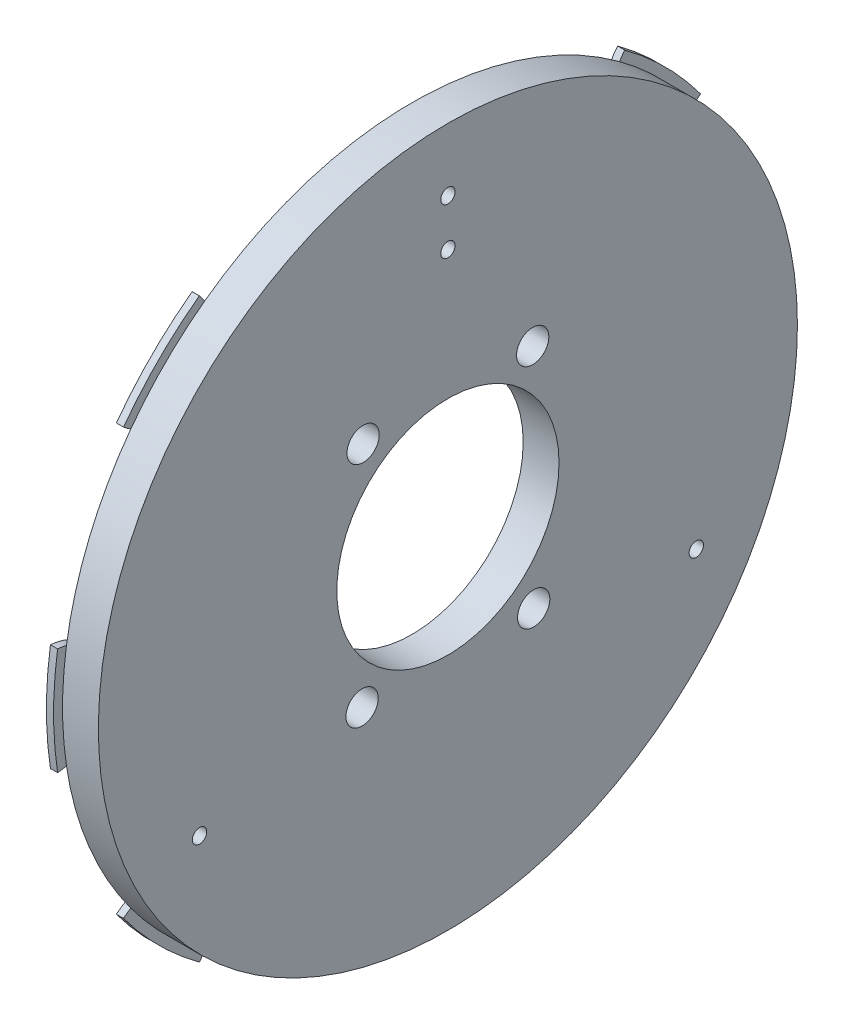
ISO-10303-21;
HEADER;
FILE_DESCRIPTION(('STEP AP214'),'2;1');
FILE_NAME('part.step','',(''),(''),'','','');
FILE_SCHEMA(('AUTOMOTIVE_DESIGN { 1 0 10303 214 1 1 1 1 }'));
ENDSEC;
DATA;
#1=APPLICATION_CONTEXT('core data for automotive mechanical design processes');
#2=APPLICATION_PROTOCOL_DEFINITION('international standard','automotive_design',2000,#1);
#3=PRODUCT_CONTEXT('',#1,'mechanical');
#4=PRODUCT('Part','Part','',(#3));
#5=PRODUCT_RELATED_PRODUCT_CATEGORY('part','',(#4));
#6=PRODUCT_DEFINITION_FORMATION('','',#4);
#7=PRODUCT_DEFINITION_CONTEXT('part definition',#1,'design');
#8=PRODUCT_DEFINITION('design','',#6,#7);
#9=PRODUCT_DEFINITION_SHAPE('','',#8);
#10=(LENGTH_UNIT() NAMED_UNIT(*) SI_UNIT(.MILLI.,.METRE.));
#11=(NAMED_UNIT(*) PLANE_ANGLE_UNIT() SI_UNIT($,.RADIAN.));
#12=(NAMED_UNIT(*) SI_UNIT($,.STERADIAN.) SOLID_ANGLE_UNIT());
#13=UNCERTAINTY_MEASURE_WITH_UNIT(LENGTH_MEASURE(1.E-05),#10,'distance_accuracy_value','');
#14=(GEOMETRIC_REPRESENTATION_CONTEXT(3) GLOBAL_UNCERTAINTY_ASSIGNED_CONTEXT((#13)) GLOBAL_UNIT_ASSIGNED_CONTEXT((#10,
#11,#12)) REPRESENTATION_CONTEXT('',''));
#15=CARTESIAN_POINT('',(0.,0.,0.));
#16=DIRECTION('',(0.,0.,1.));
#17=DIRECTION('',(1.,0.,0.));
#18=AXIS2_PLACEMENT_3D('',#15,#16,#17);
#19=CARTESIAN_POINT('',(2.,0.,0.));
#20=DIRECTION('',(1.,0.,0.));
#21=DIRECTION('',(0.,0.,-1.));
#22=AXIS2_PLACEMENT_3D('',#19,#20,#21);
#23=PLANE('',#22);
#24=CARTESIAN_POINT('',(2.,-40.000000000003,69.28203230275));
#25=DIRECTION('',(1.,0.,0.));
#26=DIRECTION('',(0.,0.,-1.));
#27=AXIS2_PLACEMENT_3D('',#24,#25,#26);
#28=CIRCLE('',#27,2.);
#29=CARTESIAN_POINT('',(2.,-40.000000000003,67.28203230275));
#30=VERTEX_POINT('',#29);
#31=EDGE_CURVE('E380',#30,#30,#28,.T.);
#32=ORIENTED_EDGE('',*,*,#31,.T.);
#33=EDGE_LOOP('',(#32));
#34=FACE_BOUND('',#33,.T.);
#35=CARTESIAN_POINT('',(2.,-39.999999999997,-69.2820323027602));
#36=DIRECTION('',(1.,0.,0.));
#37=DIRECTION('',(0.,0.,-1.));
#38=AXIS2_PLACEMENT_3D('',#35,#36,#37);
#39=CIRCLE('',#38,2.);
#40=CARTESIAN_POINT('',(2.,-39.999999999997,-71.2820323027602));
#41=VERTEX_POINT('',#40);
#42=EDGE_CURVE('E385',#41,#41,#39,.T.);
#43=ORIENTED_EDGE('',*,*,#42,.T.);
#44=EDGE_LOOP('',(#43));
#45=FACE_BOUND('',#44,.T.);
#46=CARTESIAN_POINT('',(2.,31.8556607999269,23.65));
#47=DIRECTION('',(1.,0.,0.));
#48=DIRECTION('',(0.,0.,-1.));
#49=AXIS2_PLACEMENT_3D('',#46,#47,#48);
#50=CIRCLE('',#49,4.50000000000001);
#51=CARTESIAN_POINT('',(2.,31.8556607999269,19.15));
#52=VERTEX_POINT('',#51);
#53=EDGE_CURVE('E393',#52,#52,#50,.T.);
#54=ORIENTED_EDGE('',*,*,#53,.T.);
#55=EDGE_LOOP('',(#54));
#56=FACE_BOUND('',#55,.T.);
#57=CARTESIAN_POINT('',(2.,-31.643709244987,23.9328496050663));
#58=DIRECTION('',(1.,0.,0.));
#59=DIRECTION('',(0.,0.,-1.));
#60=AXIS2_PLACEMENT_3D('',#57,#58,#59);
#61=CIRCLE('',#60,4.5);
#62=CARTESIAN_POINT('',(2.,-31.643709244987,19.4328496050663));
#63=VERTEX_POINT('',#62);
#64=EDGE_CURVE('E401',#63,#63,#61,.T.);
#65=ORIENTED_EDGE('',*,*,#64,.T.);
#66=EDGE_LOOP('',(#65));
#67=FACE_BOUND('',#66,.T.);
#68=CARTESIAN_POINT('',(2.,-31.643709244987,-23.9328496050663));
#69=DIRECTION('',(1.,0.,0.));
#70=DIRECTION('',(0.,0.,-1.));
#71=AXIS2_PLACEMENT_3D('',#68,#69,#70);
#72=CIRCLE('',#71,4.5);
#73=CARTESIAN_POINT('',(2.,-31.643709244987,-28.4328496050663));
#74=VERTEX_POINT('',#73);
#75=EDGE_CURVE('E409',#74,#74,#72,.T.);
#76=ORIENTED_EDGE('',*,*,#75,.T.);
#77=EDGE_LOOP('',(#76));
#78=FACE_BOUND('',#77,.T.);
#79=CARTESIAN_POINT('',(2.,31.8556607999269,-23.65));
#80=DIRECTION('',(1.,0.,0.));
#81=DIRECTION('',(0.,0.,-1.));
#82=AXIS2_PLACEMENT_3D('',#79,#80,#81);
#83=CIRCLE('',#82,4.50000000000001);
#84=CARTESIAN_POINT('',(2.,31.8556607999269,-28.15));
#85=VERTEX_POINT('',#84);
#86=EDGE_CURVE('E417',#85,#85,#83,.T.);
#87=ORIENTED_EDGE('',*,*,#86,.T.);
#88=EDGE_LOOP('',(#87));
#89=FACE_BOUND('',#88,.T.);
#90=CARTESIAN_POINT('',(2.,80.,0.));
#91=DIRECTION('',(1.,0.,0.));
#92=DIRECTION('',(0.,0.,-1.));
#93=AXIS2_PLACEMENT_3D('',#90,#91,#92);
#94=CIRCLE('',#93,2.);
#95=CARTESIAN_POINT('',(2.,80.,-2.));
#96=VERTEX_POINT('',#95);
#97=EDGE_CURVE('E425',#96,#96,#94,.T.);
#98=ORIENTED_EDGE('',*,*,#97,.T.);
#99=EDGE_LOOP('',(#98));
#100=FACE_BOUND('',#99,.T.);
#101=CARTESIAN_POINT('',(2.,0.,0.));
#102=DIRECTION('',(1.,0.,0.));
#103=DIRECTION('',(0.,0.,-1.));
#104=AXIS2_PLACEMENT_3D('',#101,#102,#103);
#105=CIRCLE('',#104,31.);
#106=CARTESIAN_POINT('',(2.,0.,-31.));
#107=VERTEX_POINT('',#106);
#108=EDGE_CURVE('E433',#107,#107,#105,.T.);
#109=ORIENTED_EDGE('',*,*,#108,.T.);
#110=EDGE_LOOP('',(#109));
#111=FACE_BOUND('',#110,.T.);
#112=CARTESIAN_POINT('',(2.,-70.7106781186549,70.7106781186546));
#113=DIRECTION('',(-1.,0.,0.));
#114=DIRECTION('',(0.,0.,1.));
#115=AXIS2_PLACEMENT_3D('',#112,#113,#114);
#116=CIRCLE('',#115,15.);
#117=CARTESIAN_POINT('',(2.,-57.8718201554961,78.4672060920351));
#118=VERTEX_POINT('',#117);
#119=CARTESIAN_POINT('',(2.,-78.4672060920353,57.8718201554958));
#120=VERTEX_POINT('',#119);
#121=EDGE_CURVE('E248',#118,#120,#116,.T.);
#122=ORIENTED_EDGE('',*,*,#121,.F.);
#123=CARTESIAN_POINT('',(2.,0.,0.));
#124=DIRECTION('',(1.,0.,0.));
#125=DIRECTION('',(0.,0.,-1.));
#126=AXIS2_PLACEMENT_3D('',#123,#124,#125);
#127=CIRCLE('',#126,97.5);
#128=CARTESIAN_POINT('',(2.,-14.563137056881,96.40625));
#129=VERTEX_POINT('',#128);
#130=EDGE_CURVE('E469',#129,#118,#127,.T.);
#131=ORIENTED_EDGE('',*,*,#130,.F.);
#132=CARTESIAN_POINT('',(2.,0.,100.));
#133=DIRECTION('',(-1.,0.,0.));
#134=DIRECTION('',(0.,0.,1.));
#135=AXIS2_PLACEMENT_3D('',#132,#133,#134);
#136=CIRCLE('',#135,15.);
#137=CARTESIAN_POINT('',(2.,14.563137056881,96.40625));
#138=VERTEX_POINT('',#137);
#139=EDGE_CURVE('E348',#138,#129,#136,.T.);
#140=ORIENTED_EDGE('',*,*,#139,.F.);
#141=CARTESIAN_POINT('',(2.,57.871820155495,78.467206092036));
#142=VERTEX_POINT('',#141);
#143=EDGE_CURVE('E452',#142,#138,#127,.T.);
#144=ORIENTED_EDGE('',*,*,#143,.F.);
#145=CARTESIAN_POINT('',(2.,70.7106781186539,70.7106781186556));
#146=DIRECTION('',(-1.,0.,0.));
#147=DIRECTION('',(0.,0.,1.));
#148=AXIS2_PLACEMENT_3D('',#145,#146,#147);
#149=CIRCLE('',#148,15.);
#150=CARTESIAN_POINT('',(2.,78.4672060920346,57.8718201554969));
#151=VERTEX_POINT('',#150);
#152=EDGE_CURVE('E370',#151,#142,#149,.T.);
#153=ORIENTED_EDGE('',*,*,#152,.F.);
#154=CARTESIAN_POINT('',(2.,78.4672060920357,-57.8718201554953));
#155=VERTEX_POINT('',#154);
#156=EDGE_CURVE('E441',#155,#151,#127,.T.);
#157=ORIENTED_EDGE('',*,*,#156,.F.);
#158=CARTESIAN_POINT('',(2.,70.7106781186554,-70.7106781186541));
#159=DIRECTION('',(-1.,0.,0.));
#160=DIRECTION('',(0.,0.,1.));
#161=AXIS2_PLACEMENT_3D('',#158,#159,#160);
#162=CIRCLE('',#161,15.);
#163=CARTESIAN_POINT('',(2.,57.8718201554967,-78.4672060920347));
#164=VERTEX_POINT('',#163);
#165=EDGE_CURVE('E323',#164,#155,#162,.T.);
#166=ORIENTED_EDGE('',*,*,#165,.F.);
#167=CARTESIAN_POINT('',(2.,14.5631370568816,-96.4062499999999));
#168=VERTEX_POINT('',#167);
#169=EDGE_CURVE('E481',#168,#164,#127,.T.);
#170=ORIENTED_EDGE('',*,*,#169,.F.);
#171=CARTESIAN_POINT('',(2.,6.98296267768627E-13,-100.));
#172=DIRECTION('',(-1.,0.,0.));
#173=DIRECTION('',(0.,0.,1.));
#174=AXIS2_PLACEMENT_3D('',#171,#172,#173);
#175=CIRCLE('',#174,15.);
#176=CARTESIAN_POINT('',(2.,-14.5631370568803,-96.4062500000001));
#177=VERTEX_POINT('',#176);
#178=EDGE_CURVE('E298',#177,#168,#175,.T.);
#179=ORIENTED_EDGE('',*,*,#178,.F.);
#180=CARTESIAN_POINT('',(2.,-57.8718201554955,-78.4672060920356));
#181=VERTEX_POINT('',#180);
#182=EDGE_CURVE('E476',#181,#177,#127,.T.);
#183=ORIENTED_EDGE('',*,*,#182,.F.);
#184=CARTESIAN_POINT('',(2.,-70.7106781186543,-70.7106781186551));
#185=DIRECTION('',(-1.,0.,0.));
#186=DIRECTION('',(0.,0.,1.));
#187=AXIS2_PLACEMENT_3D('',#184,#185,#186);
#188=CIRCLE('',#187,15.);
#189=CARTESIAN_POINT('',(2.,-78.4672060920349,-57.8718201554964));
#190=VERTEX_POINT('',#189);
#191=EDGE_CURVE('E273',#190,#181,#188,.T.);
#192=ORIENTED_EDGE('',*,*,#191,.F.);
#193=EDGE_CURVE('E453',#120,#190,#127,.T.);
#194=ORIENTED_EDGE('',*,*,#193,.F.);
#195=EDGE_LOOP('',(#122,#131,#140,#144,#153,#157,#166,#170,#179,#183,#192,#194));
#196=FACE_BOUND('',#195,.T.);
#197=CARTESIAN_POINT('',(2.,67.,0.));
#198=DIRECTION('',(-1.,0.,0.));
#199=DIRECTION('',(0.,0.,1.));
#200=AXIS2_PLACEMENT_3D('',#197,#198,#199);
#201=CIRCLE('',#200,2.);
#202=CARTESIAN_POINT('',(2.,67.,2.));
#203=VERTEX_POINT('',#202);
#204=EDGE_CURVE('E217',#203,#203,#201,.T.);
#205=ORIENTED_EDGE('',*,*,#204,.F.);
#206=EDGE_LOOP('',(#205));
#207=FACE_BOUND('',#206,.T.);
#208=DIRECTION('',(0.,0.,1.));
#209=VECTOR('',#208,1.);
#210=CARTESIAN_POINT('',(2.,-71.4999999999988,0.));
#211=LINE('',#210,#209);
#212=CARTESIAN_POINT('',(2.,-71.4999999999988,-12.5));
#213=VERTEX_POINT('',#212);
#214=CARTESIAN_POINT('',(2.,-71.4999999999988,12.5));
#215=VERTEX_POINT('',#214);
#216=EDGE_CURVE('E11',#213,#215,#211,.T.);
#217=ORIENTED_EDGE('',*,*,#216,.F.);
#218=DIRECTION('',(0.,-1.,0.));
#219=VECTOR('',#218,1.);
#220=CARTESIAN_POINT('',(2.,0.,-12.5));
#221=LINE('',#220,#219);
#222=CARTESIAN_POINT('',(2.,-60.4999999999988,-12.5));
#223=VERTEX_POINT('',#222);
#224=EDGE_CURVE('E458',#223,#213,#221,.T.);
#225=ORIENTED_EDGE('',*,*,#224,.F.);
#226=DIRECTION('',(0.,0.,-1.));
#227=VECTOR('',#226,1.);
#228=CARTESIAN_POINT('',(2.,-60.4999999999988,0.));
#229=LINE('',#228,#227);
#230=CARTESIAN_POINT('',(2.,-60.4999999999988,12.5));
#231=VERTEX_POINT('',#230);
#232=EDGE_CURVE('E454',#231,#223,#229,.T.);
#233=ORIENTED_EDGE('',*,*,#232,.F.);
#234=DIRECTION('',(0.,-1.,0.));
#235=VECTOR('',#234,1.);
#236=CARTESIAN_POINT('',(2.,0.,12.5));
#237=LINE('',#236,#235);
#238=EDGE_CURVE('E56',#231,#215,#237,.T.);
#239=ORIENTED_EDGE('',*,*,#238,.T.);
#240=EDGE_LOOP('',(#217,#225,#233,#239));
#241=FACE_BOUND('',#240,.T.);
#242=ADVANCED_FACE('F47',(#34,#45,#56,#67,#78,#89,#100,#111,#196,#207,#241),#23,.F.);
#243=CARTESIAN_POINT('',(12.,0.,0.));
#244=DIRECTION('',(1.,0.,0.));
#245=DIRECTION('',(0.,0.,-1.));
#246=AXIS2_PLACEMENT_3D('',#243,#244,#245);
#247=PLANE('',#246);
#248=CARTESIAN_POINT('',(12.,67.,0.));
#249=DIRECTION('',(-1.,0.,0.));
#250=DIRECTION('',(0.,0.,1.));
#251=AXIS2_PLACEMENT_3D('',#248,#249,#250);
#252=CIRCLE('',#251,2.);
#253=CARTESIAN_POINT('',(12.,67.,2.));
#254=VERTEX_POINT('',#253);
#255=EDGE_CURVE('E223',#254,#254,#252,.T.);
#256=ORIENTED_EDGE('',*,*,#255,.T.);
#257=EDGE_LOOP('',(#256));
#258=FACE_BOUND('',#257,.T.);
#259=CARTESIAN_POINT('',(12.,-39.999999999997,-69.2820323027602));
#260=DIRECTION('',(1.,0.,0.));
#261=DIRECTION('',(0.,0.,-1.));
#262=AXIS2_PLACEMENT_3D('',#259,#260,#261);
#263=CIRCLE('',#262,2.);
#264=CARTESIAN_POINT('',(12.,-39.999999999997,-71.2820323027602));
#265=VERTEX_POINT('',#264);
#266=EDGE_CURVE('E389',#265,#265,#263,.T.);
#267=ORIENTED_EDGE('',*,*,#266,.F.);
#268=EDGE_LOOP('',(#267));
#269=FACE_BOUND('',#268,.T.);
#270=CARTESIAN_POINT('',(12.,-31.643709244987,23.9328496050663));
#271=DIRECTION('',(1.,0.,0.));
#272=DIRECTION('',(0.,0.,-1.));
#273=AXIS2_PLACEMENT_3D('',#270,#271,#272);
#274=CIRCLE('',#273,4.5);
#275=CARTESIAN_POINT('',(12.,-31.643709244987,19.4328496050663));
#276=VERTEX_POINT('',#275);
#277=EDGE_CURVE('E405',#276,#276,#274,.T.);
#278=ORIENTED_EDGE('',*,*,#277,.F.);
#279=EDGE_LOOP('',(#278));
#280=FACE_BOUND('',#279,.T.);
#281=CARTESIAN_POINT('',(12.,31.8556607999269,-23.65));
#282=DIRECTION('',(1.,0.,0.));
#283=DIRECTION('',(0.,0.,-1.));
#284=AXIS2_PLACEMENT_3D('',#281,#282,#283);
#285=CIRCLE('',#284,4.50000000000001);
#286=CARTESIAN_POINT('',(12.,31.8556607999269,-28.15));
#287=VERTEX_POINT('',#286);
#288=EDGE_CURVE('E421',#287,#287,#285,.T.);
#289=ORIENTED_EDGE('',*,*,#288,.F.);
#290=EDGE_LOOP('',(#289));
#291=FACE_BOUND('',#290,.T.);
#292=CARTESIAN_POINT('',(12.,0.,0.));
#293=DIRECTION('',(1.,0.,0.));
#294=DIRECTION('',(0.,0.,-1.));
#295=AXIS2_PLACEMENT_3D('',#292,#293,#294);
#296=CIRCLE('',#295,31.);
#297=CARTESIAN_POINT('',(12.,0.,-31.));
#298=VERTEX_POINT('',#297);
#299=EDGE_CURVE('E437',#298,#298,#296,.T.);
#300=ORIENTED_EDGE('',*,*,#299,.F.);
#301=EDGE_LOOP('',(#300));
#302=FACE_BOUND('',#301,.T.);
#303=CARTESIAN_POINT('',(12.,0.,0.));
#304=DIRECTION('',(1.,0.,0.));
#305=DIRECTION('',(0.,0.,-1.));
#306=AXIS2_PLACEMENT_3D('',#303,#304,#305);
#307=CIRCLE('',#306,97.5);
#308=CARTESIAN_POINT('',(12.,0.,-97.5));
#309=VERTEX_POINT('',#308);
#310=EDGE_CURVE('E445',#309,#309,#307,.T.);
#311=ORIENTED_EDGE('',*,*,#310,.T.);
#312=EDGE_LOOP('',(#311));
#313=FACE_BOUND('',#312,.T.);
#314=CARTESIAN_POINT('',(12.,80.,0.));
#315=DIRECTION('',(1.,0.,0.));
#316=DIRECTION('',(0.,0.,-1.));
#317=AXIS2_PLACEMENT_3D('',#314,#315,#316);
#318=CIRCLE('',#317,2.);
#319=CARTESIAN_POINT('',(12.,80.,-2.));
#320=VERTEX_POINT('',#319);
#321=EDGE_CURVE('E429',#320,#320,#318,.T.);
#322=ORIENTED_EDGE('',*,*,#321,.F.);
#323=EDGE_LOOP('',(#322));
#324=FACE_BOUND('',#323,.T.);
#325=CARTESIAN_POINT('',(12.,-31.643709244987,-23.9328496050663));
#326=DIRECTION('',(1.,0.,0.));
#327=DIRECTION('',(0.,0.,-1.));
#328=AXIS2_PLACEMENT_3D('',#325,#326,#327);
#329=CIRCLE('',#328,4.5);
#330=CARTESIAN_POINT('',(12.,-31.643709244987,-28.4328496050663));
#331=VERTEX_POINT('',#330);
#332=EDGE_CURVE('E413',#331,#331,#329,.T.);
#333=ORIENTED_EDGE('',*,*,#332,.F.);
#334=EDGE_LOOP('',(#333));
#335=FACE_BOUND('',#334,.T.);
#336=CARTESIAN_POINT('',(12.,31.8556607999269,23.65));
#337=DIRECTION('',(1.,0.,0.));
#338=DIRECTION('',(0.,0.,-1.));
#339=AXIS2_PLACEMENT_3D('',#336,#337,#338);
#340=CIRCLE('',#339,4.50000000000001);
#341=CARTESIAN_POINT('',(12.,31.8556607999269,19.15));
#342=VERTEX_POINT('',#341);
#343=EDGE_CURVE('E397',#342,#342,#340,.T.);
#344=ORIENTED_EDGE('',*,*,#343,.F.);
#345=EDGE_LOOP('',(#344));
#346=FACE_BOUND('',#345,.T.);
#347=CARTESIAN_POINT('',(12.,-40.000000000003,69.28203230275));
#348=DIRECTION('',(1.,0.,0.));
#349=DIRECTION('',(0.,0.,-1.));
#350=AXIS2_PLACEMENT_3D('',#347,#348,#349);
#351=CIRCLE('',#350,2.);
#352=CARTESIAN_POINT('',(12.,-40.000000000003,67.28203230275));
#353=VERTEX_POINT('',#352);
#354=EDGE_CURVE('E381',#353,#353,#351,.T.);
#355=ORIENTED_EDGE('',*,*,#354,.F.);
#356=EDGE_LOOP('',(#355));
#357=FACE_BOUND('',#356,.T.);
#358=ADVANCED_FACE('F526',(#258,#269,#280,#291,#302,#313,#324,#335,#346,#357),#247,.T.);
#359=CARTESIAN_POINT('',(12.,0.,0.));
#360=DIRECTION('',(-1.,0.,0.));
#361=DIRECTION('',(0.,0.,1.));
#362=AXIS2_PLACEMENT_3D('',#359,#360,#361);
#363=CYLINDRICAL_SURFACE('',#362,97.5);
#364=ORIENTED_EDGE('',*,*,#310,.F.);
#365=EDGE_LOOP('',(#364));
#366=FACE_BOUND('',#365,.T.);
#367=EDGE_CURVE('E449',#151,#142,#127,.T.);
#368=ORIENTED_EDGE('',*,*,#367,.T.);
#369=ORIENTED_EDGE('',*,*,#143,.T.);
#370=EDGE_CURVE('E466',#138,#129,#127,.T.);
#371=ORIENTED_EDGE('',*,*,#370,.T.);
#372=ORIENTED_EDGE('',*,*,#130,.T.);
#373=EDGE_CURVE('E472',#118,#120,#127,.T.);
#374=ORIENTED_EDGE('',*,*,#373,.T.);
#375=ORIENTED_EDGE('',*,*,#193,.T.);
#376=EDGE_CURVE('E478',#190,#181,#127,.T.);
#377=ORIENTED_EDGE('',*,*,#376,.T.);
#378=ORIENTED_EDGE('',*,*,#182,.T.);
#379=EDGE_CURVE('E483',#177,#168,#127,.T.);
#380=ORIENTED_EDGE('',*,*,#379,.T.);
#381=ORIENTED_EDGE('',*,*,#169,.T.);
#382=EDGE_CURVE('E473',#164,#155,#127,.T.);
#383=ORIENTED_EDGE('',*,*,#382,.T.);
#384=ORIENTED_EDGE('',*,*,#156,.T.);
#385=EDGE_LOOP('',(#368,#369,#371,#372,#374,#375,#377,#378,#380,#381,#383,#384));
#386=FACE_BOUND('',#385,.T.);
#387=ADVANCED_FACE('F49',(#366,#386),#363,.T.);
#388=CARTESIAN_POINT('',(12.,0.,0.));
#389=DIRECTION('',(-1.,0.,0.));
#390=DIRECTION('',(0.,0.,1.));
#391=AXIS2_PLACEMENT_3D('',#388,#389,#390);
#392=CYLINDRICAL_SURFACE('',#391,31.);
#393=ORIENTED_EDGE('',*,*,#299,.T.);
#394=EDGE_LOOP('',(#393));
#395=FACE_BOUND('',#394,.T.);
#396=ORIENTED_EDGE('',*,*,#108,.F.);
#397=EDGE_LOOP('',(#396));
#398=FACE_BOUND('',#397,.T.);
#399=ADVANCED_FACE('F537',(#395,#398),#392,.F.);
#400=CARTESIAN_POINT('',(12.,80.,0.));
#401=DIRECTION('',(-1.,0.,0.));
#402=DIRECTION('',(0.,0.,1.));
#403=AXIS2_PLACEMENT_3D('',#400,#401,#402);
#404=CYLINDRICAL_SURFACE('',#403,2.);
#405=ORIENTED_EDGE('',*,*,#321,.T.);
#406=EDGE_LOOP('',(#405));
#407=FACE_BOUND('',#406,.T.);
#408=ORIENTED_EDGE('',*,*,#97,.F.);
#409=EDGE_LOOP('',(#408));
#410=FACE_BOUND('',#409,.T.);
#411=ADVANCED_FACE('F540',(#407,#410),#404,.F.);
#412=CARTESIAN_POINT('',(12.,31.8556607999269,-23.65));
#413=DIRECTION('',(-1.,0.,0.));
#414=DIRECTION('',(0.,0.,1.));
#415=AXIS2_PLACEMENT_3D('',#412,#413,#414);
#416=CYLINDRICAL_SURFACE('',#415,4.50000000000001);
#417=ORIENTED_EDGE('',*,*,#288,.T.);
#418=EDGE_LOOP('',(#417));
#419=FACE_BOUND('',#418,.T.);
#420=ORIENTED_EDGE('',*,*,#86,.F.);
#421=EDGE_LOOP('',(#420));
#422=FACE_BOUND('',#421,.T.);
#423=ADVANCED_FACE('F544',(#419,#422),#416,.F.);
#424=CARTESIAN_POINT('',(12.,-31.643709244987,-23.9328496050663));
#425=DIRECTION('',(-1.,0.,0.));
#426=DIRECTION('',(0.,0.,1.));
#427=AXIS2_PLACEMENT_3D('',#424,#425,#426);
#428=CYLINDRICAL_SURFACE('',#427,4.5);
#429=ORIENTED_EDGE('',*,*,#332,.T.);
#430=EDGE_LOOP('',(#429));
#431=FACE_BOUND('',#430,.T.);
#432=ORIENTED_EDGE('',*,*,#75,.F.);
#433=EDGE_LOOP('',(#432));
#434=FACE_BOUND('',#433,.T.);
#435=ADVANCED_FACE('F548',(#431,#434),#428,.F.);
#436=CARTESIAN_POINT('',(12.,-31.643709244987,23.9328496050663));
#437=DIRECTION('',(-1.,0.,0.));
#438=DIRECTION('',(0.,0.,1.));
#439=AXIS2_PLACEMENT_3D('',#436,#437,#438);
#440=CYLINDRICAL_SURFACE('',#439,4.5);
#441=ORIENTED_EDGE('',*,*,#277,.T.);
#442=EDGE_LOOP('',(#441));
#443=FACE_BOUND('',#442,.T.);
#444=ORIENTED_EDGE('',*,*,#64,.F.);
#445=EDGE_LOOP('',(#444));
#446=FACE_BOUND('',#445,.T.);
#447=ADVANCED_FACE('F552',(#443,#446),#440,.F.);
#448=CARTESIAN_POINT('',(12.,31.8556607999269,23.65));
#449=DIRECTION('',(-1.,0.,0.));
#450=DIRECTION('',(0.,0.,1.));
#451=AXIS2_PLACEMENT_3D('',#448,#449,#450);
#452=CYLINDRICAL_SURFACE('',#451,4.50000000000001);
#453=ORIENTED_EDGE('',*,*,#343,.T.);
#454=EDGE_LOOP('',(#453));
#455=FACE_BOUND('',#454,.T.);
#456=ORIENTED_EDGE('',*,*,#53,.F.);
#457=EDGE_LOOP('',(#456));
#458=FACE_BOUND('',#457,.T.);
#459=ADVANCED_FACE('F556',(#455,#458),#452,.F.);
#460=CARTESIAN_POINT('',(12.,-39.999999999997,-69.2820323027602));
#461=DIRECTION('',(-1.,0.,0.));
#462=DIRECTION('',(0.,0.,1.));
#463=AXIS2_PLACEMENT_3D('',#460,#461,#462);
#464=CYLINDRICAL_SURFACE('',#463,2.);
#465=ORIENTED_EDGE('',*,*,#266,.T.);
#466=EDGE_LOOP('',(#465));
#467=FACE_BOUND('',#466,.T.);
#468=ORIENTED_EDGE('',*,*,#42,.F.);
#469=EDGE_LOOP('',(#468));
#470=FACE_BOUND('',#469,.T.);
#471=ADVANCED_FACE('F560',(#467,#470),#464,.F.);
#472=CARTESIAN_POINT('',(12.,-40.000000000003,69.28203230275));
#473=DIRECTION('',(-1.,0.,0.));
#474=DIRECTION('',(0.,0.,1.));
#475=AXIS2_PLACEMENT_3D('',#472,#473,#474);
#476=CYLINDRICAL_SURFACE('',#475,2.);
#477=ORIENTED_EDGE('',*,*,#354,.T.);
#478=EDGE_LOOP('',(#477));
#479=FACE_BOUND('',#478,.T.);
#480=ORIENTED_EDGE('',*,*,#31,.F.);
#481=EDGE_LOOP('',(#480));
#482=FACE_BOUND('',#481,.T.);
#483=ADVANCED_FACE('F564',(#479,#482),#476,.F.);
#484=CARTESIAN_POINT('',(0.,70.7106781186539,70.7106781186556));
#485=DIRECTION('',(1.,0.,0.));
#486=DIRECTION('',(0.,0.,-1.));
#487=AXIS2_PLACEMENT_3D('',#484,#485,#486);
#488=CYLINDRICAL_SURFACE('',#487,15.);
#489=CARTESIAN_POINT('',(2.,80.491911571947,59.338454407693));
#490=VERTEX_POINT('',#489);
#491=EDGE_CURVE('E366',#490,#151,#149,.T.);
#492=ORIENTED_EDGE('',*,*,#491,.T.);
#493=ORIENTED_EDGE('',*,*,#152,.T.);
#494=CARTESIAN_POINT('',(2.,59.3384544076911,80.4919115719485));
#495=VERTEX_POINT('',#494);
#496=EDGE_CURVE('E356',#142,#495,#149,.T.);
#497=ORIENTED_EDGE('',*,*,#496,.T.);
#498=DIRECTION('',(1.,0.,0.));
#499=VECTOR('',#498,1.);
#500=CARTESIAN_POINT('',(0.,59.3384544076911,80.4919115719485));
#501=LINE('',#500,#499);
#502=CARTESIAN_POINT('',(0.,59.3384544076911,80.4919115719485));
#503=VERTEX_POINT('',#502);
#504=EDGE_CURVE('E376',#503,#495,#501,.T.);
#505=ORIENTED_EDGE('',*,*,#504,.F.);
#506=CARTESIAN_POINT('',(0.,70.7106781186539,70.7106781186556));
#507=DIRECTION('',(-1.,0.,0.));
#508=DIRECTION('',(0.,0.,1.));
#509=AXIS2_PLACEMENT_3D('',#506,#507,#508);
#510=CIRCLE('',#509,15.);
#511=CARTESIAN_POINT('',(0.,80.491911571947,59.338454407693));
#512=VERTEX_POINT('',#511);
#513=EDGE_CURVE('E357',#512,#503,#510,.T.);
#514=ORIENTED_EDGE('',*,*,#513,.F.);
#515=DIRECTION('',(1.,0.,0.));
#516=VECTOR('',#515,1.);
#517=CARTESIAN_POINT('',(0.,80.491911571947,59.338454407693));
#518=LINE('',#517,#516);
#519=EDGE_CURVE('E365',#512,#490,#518,.T.);
#520=ORIENTED_EDGE('',*,*,#519,.T.);
#521=EDGE_LOOP('',(#492,#493,#497,#505,#514,#520));
#522=FACE_BOUND('',#521,.T.);
#523=ADVANCED_FACE('F568',(#522),#488,.T.);
#524=CARTESIAN_POINT('',(0.,0.,0.));
#525=DIRECTION('',(1.,0.,0.));
#526=DIRECTION('',(0.,0.,-1.));
#527=AXIS2_PLACEMENT_3D('',#524,#525,#526);
#528=CYLINDRICAL_SURFACE('',#527,100.);
#529=CARTESIAN_POINT('',(2.,0.,0.));
#530=DIRECTION('',(-1.,0.,0.));
#531=DIRECTION('',(0.,0.,1.));
#532=AXIS2_PLACEMENT_3D('',#529,#530,#531);
#533=CIRCLE('',#532,100.);
#534=EDGE_CURVE('E362',#495,#490,#533,.T.);
#535=ORIENTED_EDGE('',*,*,#534,.T.);
#536=ORIENTED_EDGE('',*,*,#519,.F.);
#537=CARTESIAN_POINT('',(0.,0.,0.));
#538=DIRECTION('',(-1.,0.,0.));
#539=DIRECTION('',(0.,0.,1.));
#540=AXIS2_PLACEMENT_3D('',#537,#538,#539);
#541=CIRCLE('',#540,100.);
#542=EDGE_CURVE('E361',#503,#512,#541,.T.);
#543=ORIENTED_EDGE('',*,*,#542,.F.);
#544=ORIENTED_EDGE('',*,*,#504,.T.);
#545=EDGE_LOOP('',(#535,#536,#543,#544));
#546=FACE_BOUND('',#545,.T.);
#547=ADVANCED_FACE('F572',(#546),#528,.T.);
#548=CARTESIAN_POINT('',(0.,35.3553390593269,35.3553390593278));
#549=DIRECTION('',(-1.,0.,0.));
#550=DIRECTION('',(0.,0.,1.));
#551=AXIS2_PLACEMENT_3D('',#548,#549,#550);
#552=PLANE('',#551);
#553=ORIENTED_EDGE('',*,*,#513,.T.);
#554=ORIENTED_EDGE('',*,*,#542,.T.);
#555=EDGE_LOOP('',(#553,#554));
#556=FACE_BOUND('',#555,.T.);
#557=ADVANCED_FACE('F576',(#556),#552,.T.);
#558=CARTESIAN_POINT('',(2.,35.3553390593269,35.3553390593278));
#559=DIRECTION('',(-1.,0.,0.));
#560=DIRECTION('',(0.,0.,1.));
#561=AXIS2_PLACEMENT_3D('',#558,#559,#560);
#562=PLANE('',#561);
#563=ORIENTED_EDGE('',*,*,#367,.F.);
#564=ORIENTED_EDGE('',*,*,#491,.F.);
#565=ORIENTED_EDGE('',*,*,#534,.F.);
#566=ORIENTED_EDGE('',*,*,#496,.F.);
#567=EDGE_LOOP('',(#563,#564,#565,#566));
#568=FACE_BOUND('',#567,.T.);
#569=ADVANCED_FACE('F578',(#568),#562,.F.);
#570=CARTESIAN_POINT('',(0.,0.,0.));
#571=DIRECTION('',(1.,0.,0.));
#572=DIRECTION('',(0.,0.,-1.));
#573=AXIS2_PLACEMENT_3D('',#570,#571,#572);
#574=CYLINDRICAL_SURFACE('',#573,100.);
#575=CARTESIAN_POINT('',(2.,0.,0.));
#576=DIRECTION('',(-1.,0.,0.));
#577=DIRECTION('',(0.,0.,1.));
#578=AXIS2_PLACEMENT_3D('',#575,#576,#577);
#579=CIRCLE('',#578,100.);
#580=CARTESIAN_POINT('',(2.,-14.9577530063843,98.875));
#581=VERTEX_POINT('',#580);
#582=CARTESIAN_POINT('',(2.,14.9577530063843,98.875));
#583=VERTEX_POINT('',#582);
#584=EDGE_CURVE('E331',#581,#583,#579,.T.);
#585=ORIENTED_EDGE('',*,*,#584,.T.);
#586=DIRECTION('',(1.,0.,0.));
#587=VECTOR('',#586,1.);
#588=CARTESIAN_POINT('',(0.,14.9577530063843,98.875));
#589=LINE('',#588,#587);
#590=CARTESIAN_POINT('',(0.,14.9577530063843,98.875));
#591=VERTEX_POINT('',#590);
#592=EDGE_CURVE('E352',#591,#583,#589,.T.);
#593=ORIENTED_EDGE('',*,*,#592,.F.);
#594=CARTESIAN_POINT('',(0.,0.,0.));
#595=DIRECTION('',(-1.,0.,0.));
#596=DIRECTION('',(0.,0.,1.));
#597=AXIS2_PLACEMENT_3D('',#594,#595,#596);
#598=CIRCLE('',#597,100.);
#599=CARTESIAN_POINT('',(0.,-14.9577530063843,98.875));
#600=VERTEX_POINT('',#599);
#601=EDGE_CURVE('E332',#600,#591,#598,.T.);
#602=ORIENTED_EDGE('',*,*,#601,.F.);
#603=DIRECTION('',(1.,0.,0.));
#604=VECTOR('',#603,1.);
#605=CARTESIAN_POINT('',(0.,-14.9577530063843,98.875));
#606=LINE('',#605,#604);
#607=EDGE_CURVE('E340',#600,#581,#606,.T.);
#608=ORIENTED_EDGE('',*,*,#607,.T.);
#609=EDGE_LOOP('',(#585,#593,#602,#608));
#610=FACE_BOUND('',#609,.T.);
#611=ADVANCED_FACE('F581',(#610),#574,.T.);
#612=CARTESIAN_POINT('',(0.,0.,100.));
#613=DIRECTION('',(1.,0.,0.));
#614=DIRECTION('',(0.,0.,-1.));
#615=AXIS2_PLACEMENT_3D('',#612,#613,#614);
#616=CYLINDRICAL_SURFACE('',#615,15.);
#617=EDGE_CURVE('E337',#583,#138,#136,.T.);
#618=ORIENTED_EDGE('',*,*,#617,.T.);
#619=ORIENTED_EDGE('',*,*,#139,.T.);
#620=EDGE_CURVE('E344',#129,#581,#136,.T.);
#621=ORIENTED_EDGE('',*,*,#620,.T.);
#622=ORIENTED_EDGE('',*,*,#607,.F.);
#623=CARTESIAN_POINT('',(0.,0.,100.));
#624=DIRECTION('',(-1.,0.,0.));
#625=DIRECTION('',(0.,0.,1.));
#626=AXIS2_PLACEMENT_3D('',#623,#624,#625);
#627=CIRCLE('',#626,15.);
#628=EDGE_CURVE('E336',#591,#600,#627,.T.);
#629=ORIENTED_EDGE('',*,*,#628,.F.);
#630=ORIENTED_EDGE('',*,*,#592,.T.);
#631=EDGE_LOOP('',(#618,#619,#621,#622,#629,#630));
#632=FACE_BOUND('',#631,.T.);
#633=ADVANCED_FACE('F588',(#632),#616,.T.);
#634=CARTESIAN_POINT('',(0.,0.,50.));
#635=DIRECTION('',(-1.,0.,0.));
#636=DIRECTION('',(0.,0.,1.));
#637=AXIS2_PLACEMENT_3D('',#634,#635,#636);
#638=PLANE('',#637);
#639=ORIENTED_EDGE('',*,*,#601,.T.);
#640=ORIENTED_EDGE('',*,*,#628,.T.);
#641=EDGE_LOOP('',(#639,#640));
#642=FACE_BOUND('',#641,.T.);
#643=ADVANCED_FACE('F592',(#642),#638,.T.);
#644=CARTESIAN_POINT('',(2.,0.,50.));
#645=DIRECTION('',(-1.,0.,0.));
#646=DIRECTION('',(0.,0.,1.));
#647=AXIS2_PLACEMENT_3D('',#644,#645,#646);
#648=PLANE('',#647);
#649=ORIENTED_EDGE('',*,*,#620,.F.);
#650=ORIENTED_EDGE('',*,*,#370,.F.);
#651=ORIENTED_EDGE('',*,*,#617,.F.);
#652=ORIENTED_EDGE('',*,*,#584,.F.);
#653=EDGE_LOOP('',(#649,#650,#651,#652));
#654=FACE_BOUND('',#653,.T.);
#655=ADVANCED_FACE('F594',(#654),#648,.F.);
#656=CARTESIAN_POINT('',(0.,0.,0.));
#657=DIRECTION('',(1.,0.,0.));
#658=DIRECTION('',(0.,0.,-1.));
#659=AXIS2_PLACEMENT_3D('',#656,#657,#658);
#660=CYLINDRICAL_SURFACE('',#659,100.);
#661=CARTESIAN_POINT('',(2.,0.,0.));
#662=DIRECTION('',(-1.,0.,0.));
#663=DIRECTION('',(0.,0.,1.));
#664=AXIS2_PLACEMENT_3D('',#661,#662,#663);
#665=CIRCLE('',#664,100.);
#666=CARTESIAN_POINT('',(2.,80.4919115719482,-59.3384544076914));
#667=VERTEX_POINT('',#666);
#668=CARTESIAN_POINT('',(2.,59.3384544076928,-80.4919115719472));
#669=VERTEX_POINT('',#668);
#670=EDGE_CURVE('E306',#667,#669,#665,.T.);
#671=ORIENTED_EDGE('',*,*,#670,.T.);
#672=DIRECTION('',(1.,0.,0.));
#673=VECTOR('',#672,1.);
#674=CARTESIAN_POINT('',(0.,59.3384544076928,-80.4919115719472));
#675=LINE('',#674,#673);
#676=CARTESIAN_POINT('',(0.,59.3384544076928,-80.4919115719472));
#677=VERTEX_POINT('',#676);
#678=EDGE_CURVE('E327',#677,#669,#675,.T.);
#679=ORIENTED_EDGE('',*,*,#678,.F.);
#680=CARTESIAN_POINT('',(0.,0.,0.));
#681=DIRECTION('',(-1.,0.,0.));
#682=DIRECTION('',(0.,0.,1.));
#683=AXIS2_PLACEMENT_3D('',#680,#681,#682);
#684=CIRCLE('',#683,100.);
#685=CARTESIAN_POINT('',(0.,80.4919115719482,-59.3384544076914));
#686=VERTEX_POINT('',#685);
#687=EDGE_CURVE('E307',#686,#677,#684,.T.);
#688=ORIENTED_EDGE('',*,*,#687,.F.);
#689=DIRECTION('',(1.,0.,0.));
#690=VECTOR('',#689,1.);
#691=CARTESIAN_POINT('',(0.,80.4919115719482,-59.3384544076914));
#692=LINE('',#691,#690);
#693=EDGE_CURVE('E315',#686,#667,#692,.T.);
#694=ORIENTED_EDGE('',*,*,#693,.T.);
#695=EDGE_LOOP('',(#671,#679,#688,#694));
#696=FACE_BOUND('',#695,.T.);
#697=ADVANCED_FACE('F597',(#696),#660,.T.);
#698=CARTESIAN_POINT('',(0.,70.7106781186554,-70.7106781186541));
#699=DIRECTION('',(1.,0.,0.));
#700=DIRECTION('',(0.,0.,-1.));
#701=AXIS2_PLACEMENT_3D('',#698,#699,#700);
#702=CYLINDRICAL_SURFACE('',#701,15.);
#703=EDGE_CURVE('E312',#669,#164,#162,.T.);
#704=ORIENTED_EDGE('',*,*,#703,.T.);
#705=ORIENTED_EDGE('',*,*,#165,.T.);
#706=EDGE_CURVE('E319',#155,#667,#162,.T.);
#707=ORIENTED_EDGE('',*,*,#706,.T.);
#708=ORIENTED_EDGE('',*,*,#693,.F.);
#709=CARTESIAN_POINT('',(0.,70.7106781186554,-70.7106781186541));
#710=DIRECTION('',(-1.,0.,0.));
#711=DIRECTION('',(0.,0.,1.));
#712=AXIS2_PLACEMENT_3D('',#709,#710,#711);
#713=CIRCLE('',#712,15.);
#714=EDGE_CURVE('E311',#677,#686,#713,.T.);
#715=ORIENTED_EDGE('',*,*,#714,.F.);
#716=ORIENTED_EDGE('',*,*,#678,.T.);
#717=EDGE_LOOP('',(#704,#705,#707,#708,#715,#716));
#718=FACE_BOUND('',#717,.T.);
#719=ADVANCED_FACE('F604',(#718),#702,.T.);
#720=CARTESIAN_POINT('',(0.,35.3553390593277,-35.3553390593271));
#721=DIRECTION('',(-1.,0.,0.));
#722=DIRECTION('',(0.,0.,1.));
#723=AXIS2_PLACEMENT_3D('',#720,#721,#722);
#724=PLANE('',#723);
#725=ORIENTED_EDGE('',*,*,#687,.T.);
#726=ORIENTED_EDGE('',*,*,#714,.T.);
#727=EDGE_LOOP('',(#725,#726));
#728=FACE_BOUND('',#727,.T.);
#729=ADVANCED_FACE('F608',(#728),#724,.T.);
#730=CARTESIAN_POINT('',(2.,35.3553390593277,-35.3553390593271));
#731=DIRECTION('',(-1.,0.,0.));
#732=DIRECTION('',(0.,0.,1.));
#733=AXIS2_PLACEMENT_3D('',#730,#731,#732);
#734=PLANE('',#733);
#735=ORIENTED_EDGE('',*,*,#706,.F.);
#736=ORIENTED_EDGE('',*,*,#382,.F.);
#737=ORIENTED_EDGE('',*,*,#703,.F.);
#738=ORIENTED_EDGE('',*,*,#670,.F.);
#739=EDGE_LOOP('',(#735,#736,#737,#738));
#740=FACE_BOUND('',#739,.T.);
#741=ADVANCED_FACE('F610',(#740),#734,.F.);
#742=CARTESIAN_POINT('',(0.,0.,0.));
#743=DIRECTION('',(1.,0.,0.));
#744=DIRECTION('',(0.,0.,-1.));
#745=AXIS2_PLACEMENT_3D('',#742,#743,#744);
#746=CYLINDRICAL_SURFACE('',#745,100.);
#747=CARTESIAN_POINT('',(2.,0.,0.));
#748=DIRECTION('',(-1.,0.,0.));
#749=DIRECTION('',(0.,0.,1.));
#750=AXIS2_PLACEMENT_3D('',#747,#748,#749);
#751=CIRCLE('',#750,100.);
#752=CARTESIAN_POINT('',(2.,14.957753006385,-98.8749999999999));
#753=VERTEX_POINT('',#752);
#754=CARTESIAN_POINT('',(2.,-14.9577530063837,-98.8750000000001));
#755=VERTEX_POINT('',#754);
#756=EDGE_CURVE('E281',#753,#755,#751,.T.);
#757=ORIENTED_EDGE('',*,*,#756,.T.);
#758=DIRECTION('',(1.,0.,0.));
#759=VECTOR('',#758,1.);
#760=CARTESIAN_POINT('',(0.,-14.9577530063837,-98.8750000000001));
#761=LINE('',#760,#759);
#762=CARTESIAN_POINT('',(0.,-14.9577530063837,-98.8750000000001));
#763=VERTEX_POINT('',#762);
#764=EDGE_CURVE('E302',#763,#755,#761,.T.);
#765=ORIENTED_EDGE('',*,*,#764,.F.);
#766=CARTESIAN_POINT('',(0.,0.,0.));
#767=DIRECTION('',(-1.,0.,0.));
#768=DIRECTION('',(0.,0.,1.));
#769=AXIS2_PLACEMENT_3D('',#766,#767,#768);
#770=CIRCLE('',#769,100.);
#771=CARTESIAN_POINT('',(0.,14.957753006385,-98.8749999999999));
#772=VERTEX_POINT('',#771);
#773=EDGE_CURVE('E282',#772,#763,#770,.T.);
#774=ORIENTED_EDGE('',*,*,#773,.F.);
#775=DIRECTION('',(1.,0.,0.));
#776=VECTOR('',#775,1.);
#777=CARTESIAN_POINT('',(0.,14.957753006385,-98.8749999999999));
#778=LINE('',#777,#776);
#779=EDGE_CURVE('E290',#772,#753,#778,.T.);
#780=ORIENTED_EDGE('',*,*,#779,.T.);
#781=EDGE_LOOP('',(#757,#765,#774,#780));
#782=FACE_BOUND('',#781,.T.);
#783=ADVANCED_FACE('F613',(#782),#746,.T.);
#784=CARTESIAN_POINT('',(0.,6.98296267768627E-13,-100.));
#785=DIRECTION('',(1.,0.,0.));
#786=DIRECTION('',(0.,0.,-1.));
#787=AXIS2_PLACEMENT_3D('',#784,#785,#786);
#788=CYLINDRICAL_SURFACE('',#787,15.);
#789=EDGE_CURVE('E287',#755,#177,#175,.T.);
#790=ORIENTED_EDGE('',*,*,#789,.T.);
#791=ORIENTED_EDGE('',*,*,#178,.T.);
#792=EDGE_CURVE('E294',#168,#753,#175,.T.);
#793=ORIENTED_EDGE('',*,*,#792,.T.);
#794=ORIENTED_EDGE('',*,*,#779,.F.);
#795=CARTESIAN_POINT('',(0.,6.98296267768627E-13,-100.));
#796=DIRECTION('',(-1.,0.,0.));
#797=DIRECTION('',(0.,0.,1.));
#798=AXIS2_PLACEMENT_3D('',#795,#796,#797);
#799=CIRCLE('',#798,15.);
#800=EDGE_CURVE('E286',#763,#772,#799,.T.);
#801=ORIENTED_EDGE('',*,*,#800,.F.);
#802=ORIENTED_EDGE('',*,*,#764,.T.);
#803=EDGE_LOOP('',(#790,#791,#793,#794,#801,#802));
#804=FACE_BOUND('',#803,.T.);
#805=ADVANCED_FACE('F620',(#804),#788,.T.);
#806=CARTESIAN_POINT('',(0.,3.49148133884313E-13,-50.));
#807=DIRECTION('',(-1.,0.,0.));
#808=DIRECTION('',(0.,0.,1.));
#809=AXIS2_PLACEMENT_3D('',#806,#807,#808);
#810=PLANE('',#809);
#811=ORIENTED_EDGE('',*,*,#773,.T.);
#812=ORIENTED_EDGE('',*,*,#800,.T.);
#813=EDGE_LOOP('',(#811,#812));
#814=FACE_BOUND('',#813,.T.);
#815=ADVANCED_FACE('F624',(#814),#810,.T.);
#816=CARTESIAN_POINT('',(2.,3.49148133884313E-13,-50.));
#817=DIRECTION('',(-1.,0.,0.));
#818=DIRECTION('',(0.,0.,1.));
#819=AXIS2_PLACEMENT_3D('',#816,#817,#818);
#820=PLANE('',#819);
#821=ORIENTED_EDGE('',*,*,#792,.F.);
#822=ORIENTED_EDGE('',*,*,#379,.F.);
#823=ORIENTED_EDGE('',*,*,#789,.F.);
#824=ORIENTED_EDGE('',*,*,#756,.F.);
#825=EDGE_LOOP('',(#821,#822,#823,#824));
#826=FACE_BOUND('',#825,.T.);
#827=ADVANCED_FACE('F626',(#826),#820,.F.);
#828=CARTESIAN_POINT('',(0.,0.,0.));
#829=DIRECTION('',(1.,0.,0.));
#830=DIRECTION('',(0.,0.,-1.));
#831=AXIS2_PLACEMENT_3D('',#828,#829,#830);
#832=CYLINDRICAL_SURFACE('',#831,100.);
#833=CARTESIAN_POINT('',(2.,0.,0.));
#834=DIRECTION('',(-1.,0.,0.));
#835=DIRECTION('',(0.,0.,1.));
#836=AXIS2_PLACEMENT_3D('',#833,#834,#835);
#837=CIRCLE('',#836,100.);
#838=CARTESIAN_POINT('',(2.,-59.3384544076916,-80.4919115719481));
#839=VERTEX_POINT('',#838);
#840=CARTESIAN_POINT('',(2.,-80.4919115719474,-59.3384544076925));
#841=VERTEX_POINT('',#840);
#842=EDGE_CURVE('E256',#839,#841,#837,.T.);
#843=ORIENTED_EDGE('',*,*,#842,.T.);
#844=DIRECTION('',(1.,0.,0.));
#845=VECTOR('',#844,1.);
#846=CARTESIAN_POINT('',(0.,-80.4919115719474,-59.3384544076925));
#847=LINE('',#846,#845);
#848=CARTESIAN_POINT('',(0.,-80.4919115719474,-59.3384544076925));
#849=VERTEX_POINT('',#848);
#850=EDGE_CURVE('E277',#849,#841,#847,.T.);
#851=ORIENTED_EDGE('',*,*,#850,.F.);
#852=CARTESIAN_POINT('',(0.,0.,0.));
#853=DIRECTION('',(-1.,0.,0.));
#854=DIRECTION('',(0.,0.,1.));
#855=AXIS2_PLACEMENT_3D('',#852,#853,#854);
#856=CIRCLE('',#855,100.);
#857=CARTESIAN_POINT('',(0.,-59.3384544076916,-80.4919115719481));
#858=VERTEX_POINT('',#857);
#859=EDGE_CURVE('E257',#858,#849,#856,.T.);
#860=ORIENTED_EDGE('',*,*,#859,.F.);
#861=DIRECTION('',(1.,0.,0.));
#862=VECTOR('',#861,1.);
#863=CARTESIAN_POINT('',(0.,-59.3384544076916,-80.4919115719481));
#864=LINE('',#863,#862);
#865=EDGE_CURVE('E265',#858,#839,#864,.T.);
#866=ORIENTED_EDGE('',*,*,#865,.T.);
#867=EDGE_LOOP('',(#843,#851,#860,#866));
#868=FACE_BOUND('',#867,.T.);
#869=ADVANCED_FACE('F629',(#868),#832,.T.);
#870=CARTESIAN_POINT('',(0.,-70.7106781186543,-70.7106781186551));
#871=DIRECTION('',(1.,0.,0.));
#872=DIRECTION('',(0.,0.,-1.));
#873=AXIS2_PLACEMENT_3D('',#870,#871,#872);
#874=CYLINDRICAL_SURFACE('',#873,15.);
#875=EDGE_CURVE('E262',#841,#190,#188,.T.);
#876=ORIENTED_EDGE('',*,*,#875,.T.);
#877=ORIENTED_EDGE('',*,*,#191,.T.);
#878=EDGE_CURVE('E269',#181,#839,#188,.T.);
#879=ORIENTED_EDGE('',*,*,#878,.T.);
#880=ORIENTED_EDGE('',*,*,#865,.F.);
#881=CARTESIAN_POINT('',(0.,-70.7106781186543,-70.7106781186551));
#882=DIRECTION('',(-1.,0.,0.));
#883=DIRECTION('',(0.,0.,1.));
#884=AXIS2_PLACEMENT_3D('',#881,#882,#883);
#885=CIRCLE('',#884,15.);
#886=EDGE_CURVE('E261',#849,#858,#885,.T.);
#887=ORIENTED_EDGE('',*,*,#886,.F.);
#888=ORIENTED_EDGE('',*,*,#850,.T.);
#889=EDGE_LOOP('',(#876,#877,#879,#880,#887,#888));
#890=FACE_BOUND('',#889,.T.);
#891=ADVANCED_FACE('F636',(#890),#874,.T.);
#892=CARTESIAN_POINT('',(0.,-35.3553390593272,-35.3553390593276));
#893=DIRECTION('',(-1.,0.,0.));
#894=DIRECTION('',(0.,0.,1.));
#895=AXIS2_PLACEMENT_3D('',#892,#893,#894);
#896=PLANE('',#895);
#897=ORIENTED_EDGE('',*,*,#859,.T.);
#898=ORIENTED_EDGE('',*,*,#886,.T.);
#899=EDGE_LOOP('',(#897,#898));
#900=FACE_BOUND('',#899,.T.);
#901=ADVANCED_FACE('F640',(#900),#896,.T.);
#902=CARTESIAN_POINT('',(2.,-35.3553390593272,-35.3553390593276));
#903=DIRECTION('',(-1.,0.,0.));
#904=DIRECTION('',(0.,0.,1.));
#905=AXIS2_PLACEMENT_3D('',#902,#903,#904);
#906=PLANE('',#905);
#907=ORIENTED_EDGE('',*,*,#878,.F.);
#908=ORIENTED_EDGE('',*,*,#376,.F.);
#909=ORIENTED_EDGE('',*,*,#875,.F.);
#910=ORIENTED_EDGE('',*,*,#842,.F.);
#911=EDGE_LOOP('',(#907,#908,#909,#910));
#912=FACE_BOUND('',#911,.T.);
#913=ADVANCED_FACE('F642',(#912),#906,.F.);
#914=CARTESIAN_POINT('',(0.,0.,0.));
#915=DIRECTION('',(1.,0.,0.));
#916=DIRECTION('',(0.,0.,-1.));
#917=AXIS2_PLACEMENT_3D('',#914,#915,#916);
#918=CYLINDRICAL_SURFACE('',#917,100.);
#919=CARTESIAN_POINT('',(2.,0.,0.));
#920=DIRECTION('',(-1.,0.,0.));
#921=DIRECTION('',(0.,0.,1.));
#922=AXIS2_PLACEMENT_3D('',#919,#920,#921);
#923=CIRCLE('',#922,100.);
#924=CARTESIAN_POINT('',(2.,-80.4919115719478,59.3384544076919));
#925=VERTEX_POINT('',#924);
#926=CARTESIAN_POINT('',(2.,-59.3384544076922,80.4919115719476));
#927=VERTEX_POINT('',#926);
#928=EDGE_CURVE('E230',#925,#927,#923,.T.);
#929=ORIENTED_EDGE('',*,*,#928,.T.);
#930=DIRECTION('',(1.,0.,0.));
#931=VECTOR('',#930,1.);
#932=CARTESIAN_POINT('',(0.,-59.3384544076922,80.4919115719476));
#933=LINE('',#932,#931);
#934=CARTESIAN_POINT('',(0.,-59.3384544076922,80.4919115719476));
#935=VERTEX_POINT('',#934);
#936=EDGE_CURVE('E252',#935,#927,#933,.T.);
#937=ORIENTED_EDGE('',*,*,#936,.F.);
#938=CARTESIAN_POINT('',(0.,0.,0.));
#939=DIRECTION('',(-1.,0.,0.));
#940=DIRECTION('',(0.,0.,1.));
#941=AXIS2_PLACEMENT_3D('',#938,#939,#940);
#942=CIRCLE('',#941,100.);
#943=CARTESIAN_POINT('',(0.,-80.4919115719478,59.3384544076919));
#944=VERTEX_POINT('',#943);
#945=EDGE_CURVE('E232',#944,#935,#942,.T.);
#946=ORIENTED_EDGE('',*,*,#945,.F.);
#947=DIRECTION('',(1.,0.,0.));
#948=VECTOR('',#947,1.);
#949=CARTESIAN_POINT('',(0.,-80.4919115719478,59.3384544076919));
#950=LINE('',#949,#948);
#951=EDGE_CURVE('E240',#944,#925,#950,.T.);
#952=ORIENTED_EDGE('',*,*,#951,.T.);
#953=EDGE_LOOP('',(#929,#937,#946,#952));
#954=FACE_BOUND('',#953,.T.);
#955=ADVANCED_FACE('F510',(#954),#918,.T.);
#956=CARTESIAN_POINT('',(0.,-70.7106781186549,70.7106781186546));
#957=DIRECTION('',(1.,0.,0.));
#958=DIRECTION('',(0.,0.,-1.));
#959=AXIS2_PLACEMENT_3D('',#956,#957,#958);
#960=CYLINDRICAL_SURFACE('',#959,15.);
#961=EDGE_CURVE('E237',#927,#118,#116,.T.);
#962=ORIENTED_EDGE('',*,*,#961,.T.);
#963=ORIENTED_EDGE('',*,*,#121,.T.);
#964=EDGE_CURVE('E244',#120,#925,#116,.T.);
#965=ORIENTED_EDGE('',*,*,#964,.T.);
#966=ORIENTED_EDGE('',*,*,#951,.F.);
#967=CARTESIAN_POINT('',(0.,-70.7106781186549,70.7106781186546));
#968=DIRECTION('',(-1.,0.,0.));
#969=DIRECTION('',(0.,0.,1.));
#970=AXIS2_PLACEMENT_3D('',#967,#968,#969);
#971=CIRCLE('',#970,15.);
#972=EDGE_CURVE('E236',#935,#944,#971,.T.);
#973=ORIENTED_EDGE('',*,*,#972,.F.);
#974=ORIENTED_EDGE('',*,*,#936,.T.);
#975=EDGE_LOOP('',(#962,#963,#965,#966,#973,#974));
#976=FACE_BOUND('',#975,.T.);
#977=ADVANCED_FACE('F503',(#976),#960,.T.);
#978=CARTESIAN_POINT('',(0.,-35.3553390593274,35.3553390593273));
#979=DIRECTION('',(-1.,0.,0.));
#980=DIRECTION('',(0.,0.,1.));
#981=AXIS2_PLACEMENT_3D('',#978,#979,#980);
#982=PLANE('',#981);
#983=ORIENTED_EDGE('',*,*,#945,.T.);
#984=ORIENTED_EDGE('',*,*,#972,.T.);
#985=EDGE_LOOP('',(#983,#984));
#986=FACE_BOUND('',#985,.T.);
#987=ADVANCED_FACE('F514',(#986),#982,.T.);
#988=CARTESIAN_POINT('',(2.,-35.3553390593274,35.3553390593273));
#989=DIRECTION('',(-1.,0.,0.));
#990=DIRECTION('',(0.,0.,1.));
#991=AXIS2_PLACEMENT_3D('',#988,#989,#990);
#992=PLANE('',#991);
#993=ORIENTED_EDGE('',*,*,#964,.F.);
#994=ORIENTED_EDGE('',*,*,#373,.F.);
#995=ORIENTED_EDGE('',*,*,#961,.F.);
#996=ORIENTED_EDGE('',*,*,#928,.F.);
#997=EDGE_LOOP('',(#993,#994,#995,#996));
#998=FACE_BOUND('',#997,.T.);
#999=ADVANCED_FACE('F512',(#998),#992,.F.);
#1000=CARTESIAN_POINT('',(12.,67.,0.));
#1001=DIRECTION('',(-1.,0.,0.));
#1002=DIRECTION('',(0.,0.,1.));
#1003=AXIS2_PLACEMENT_3D('',#1000,#1001,#1002);
#1004=CYLINDRICAL_SURFACE('',#1003,2.);
#1005=ORIENTED_EDGE('',*,*,#255,.F.);
#1006=EDGE_LOOP('',(#1005));
#1007=FACE_BOUND('',#1006,.T.);
#1008=ORIENTED_EDGE('',*,*,#204,.T.);
#1009=EDGE_LOOP('',(#1008));
#1010=FACE_BOUND('',#1009,.T.);
#1011=ADVANCED_FACE('F521',(#1007,#1010),#1004,.F.);
#1012=CARTESIAN_POINT('',(-21.0000000000024,-65.9999999999988,12.5));
#1013=DIRECTION('',(0.,0.,1.));
#1014=DIRECTION('',(1.,0.,0.));
#1015=AXIS2_PLACEMENT_3D('',#1012,#1013,#1014);
#1016=PLANE('',#1015);
#1017=CARTESIAN_POINT('',(-21.0000000000024,-65.9999999999988,12.5));
#1018=DIRECTION('',(0.,0.,1.));
#1019=DIRECTION('',(1.,0.,0.));
#1020=AXIS2_PLACEMENT_3D('',#1017,#1018,#1019);
#1021=CIRCLE('',#1020,5.00000000017198);
#1022=CARTESIAN_POINT('',(-15.9999999998305,-65.9999999999988,12.5));
#1023=VERTEX_POINT('',#1022);
#1024=EDGE_CURVE('E741',#1023,#1023,#1021,.T.);
#1025=ORIENTED_EDGE('',*,*,#1024,.F.);
#1026=EDGE_LOOP('',(#1025));
#1027=FACE_BOUND('',#1026,.T.);
#1028=ORIENTED_EDGE('',*,*,#238,.F.);
#1029=DIRECTION('',(-1.,0.,0.));
#1030=VECTOR('',#1029,1.);
#1031=CARTESIAN_POINT('',(-21.0000000000024,-60.4999999999988,12.5));
#1032=LINE('',#1031,#1030);
#1033=CARTESIAN_POINT('',(-21.0000000000024,-60.4999999999988,12.5));
#1034=VERTEX_POINT('',#1033);
#1035=EDGE_CURVE('E201',#231,#1034,#1032,.T.);
#1036=ORIENTED_EDGE('',*,*,#1035,.T.);
#1037=CARTESIAN_POINT('',(-21.0000000000024,-65.9999999999988,12.5));
#1038=DIRECTION('',(0.,0.,1.));
#1039=DIRECTION('',(1.,0.,0.));
#1040=AXIS2_PLACEMENT_3D('',#1037,#1038,#1039);
#1041=CIRCLE('',#1040,5.5);
#1042=CARTESIAN_POINT('',(-21.0000000000024,-71.4999999999988,12.5));
#1043=VERTEX_POINT('',#1042);
#1044=EDGE_CURVE('E202',#1034,#1043,#1041,.T.);
#1045=ORIENTED_EDGE('',*,*,#1044,.T.);
#1046=DIRECTION('',(1.,0.,0.));
#1047=VECTOR('',#1046,1.);
#1048=CARTESIAN_POINT('',(3.2124511293834,-71.4999999999988,12.5));
#1049=LINE('',#1048,#1047);
#1050=EDGE_CURVE('E192',#1043,#215,#1049,.T.);
#1051=ORIENTED_EDGE('',*,*,#1050,.T.);
#1052=EDGE_LOOP('',(#1028,#1036,#1045,#1051));
#1053=FACE_BOUND('',#1052,.T.);
#1054=ADVANCED_FACE('F205',(#1027,#1053),#1016,.T.);
#1055=CARTESIAN_POINT('',(-21.0000000000024,-65.9999999999988,-12.5));
#1056=DIRECTION('',(0.,0.,1.));
#1057=DIRECTION('',(1.,0.,0.));
#1058=AXIS2_PLACEMENT_3D('',#1055,#1056,#1057);
#1059=PLANE('',#1058);
#1060=CARTESIAN_POINT('',(-21.0000000000024,-65.9999999999988,-12.5));
#1061=DIRECTION('',(0.,0.,1.));
#1062=DIRECTION('',(1.,0.,0.));
#1063=AXIS2_PLACEMENT_3D('',#1060,#1061,#1062);
#1064=CIRCLE('',#1063,5.00000000017198);
#1065=CARTESIAN_POINT('',(-15.9999999998305,-65.9999999999988,-12.5));
#1066=VERTEX_POINT('',#1065);
#1067=EDGE_CURVE('E744',#1066,#1066,#1064,.T.);
#1068=ORIENTED_EDGE('',*,*,#1067,.T.);
#1069=EDGE_LOOP('',(#1068));
#1070=FACE_BOUND('',#1069,.T.);
#1071=DIRECTION('',(-1.,0.,0.));
#1072=VECTOR('',#1071,1.);
#1073=CARTESIAN_POINT('',(-21.0000000000024,-60.4999999999988,-12.5));
#1074=LINE('',#1073,#1072);
#1075=CARTESIAN_POINT('',(-21.0000000000024,-60.4999999999988,-12.5));
#1076=VERTEX_POINT('',#1075);
#1077=EDGE_CURVE('E211',#223,#1076,#1074,.T.);
#1078=ORIENTED_EDGE('',*,*,#1077,.F.);
#1079=ORIENTED_EDGE('',*,*,#224,.T.);
#1080=DIRECTION('',(1.,0.,0.));
#1081=VECTOR('',#1080,1.);
#1082=CARTESIAN_POINT('',(3.2124511293834,-71.4999999999988,-12.5));
#1083=LINE('',#1082,#1081);
#1084=CARTESIAN_POINT('',(-21.0000000000024,-71.4999999999988,-12.5));
#1085=VERTEX_POINT('',#1084);
#1086=EDGE_CURVE('E754',#1085,#213,#1083,.T.);
#1087=ORIENTED_EDGE('',*,*,#1086,.F.);
#1088=CARTESIAN_POINT('',(-21.0000000000024,-65.9999999999988,-12.5));
#1089=DIRECTION('',(0.,0.,1.));
#1090=DIRECTION('',(1.,0.,0.));
#1091=AXIS2_PLACEMENT_3D('',#1088,#1089,#1090);
#1092=CIRCLE('',#1091,5.5);
#1093=EDGE_CURVE('E215',#1076,#1085,#1092,.T.);
#1094=ORIENTED_EDGE('',*,*,#1093,.F.);
#1095=EDGE_LOOP('',(#1078,#1079,#1087,#1094));
#1096=FACE_BOUND('',#1095,.T.);
#1097=ADVANCED_FACE('F689',(#1070,#1096),#1059,.F.);
#1098=CARTESIAN_POINT('',(3.2124511293834,-71.4999999999988,12.5));
#1099=DIRECTION('',(0.,1.,0.));
#1100=DIRECTION('',(0.,0.,1.));
#1101=AXIS2_PLACEMENT_3D('',#1098,#1099,#1100);
#1102=PLANE('',#1101);
#1103=ORIENTED_EDGE('',*,*,#1086,.T.);
#1104=ORIENTED_EDGE('',*,*,#216,.T.);
#1105=ORIENTED_EDGE('',*,*,#1050,.F.);
#1106=DIRECTION('',(0.,0.,-1.));
#1107=VECTOR('',#1106,1.);
#1108=CARTESIAN_POINT('',(-21.0000000000024,-71.4999999999988,12.5));
#1109=LINE('',#1108,#1107);
#1110=EDGE_CURVE('E197',#1043,#1085,#1109,.T.);
#1111=ORIENTED_EDGE('',*,*,#1110,.T.);
#1112=EDGE_LOOP('',(#1103,#1104,#1105,#1111));
#1113=FACE_BOUND('',#1112,.T.);
#1114=ADVANCED_FACE('F195',(#1113),#1102,.F.);
#1115=CARTESIAN_POINT('',(-21.0000000000024,-60.4999999999988,12.5));
#1116=DIRECTION('',(0.,-1.,0.));
#1117=DIRECTION('',(0.,0.,-1.));
#1118=AXIS2_PLACEMENT_3D('',#1115,#1116,#1117);
#1119=PLANE('',#1118);
#1120=ORIENTED_EDGE('',*,*,#1035,.F.);
#1121=ORIENTED_EDGE('',*,*,#232,.T.);
#1122=ORIENTED_EDGE('',*,*,#1077,.T.);
#1123=DIRECTION('',(0.,0.,-1.));
#1124=VECTOR('',#1123,1.);
#1125=CARTESIAN_POINT('',(-21.0000000000024,-60.4999999999988,12.5));
#1126=LINE('',#1125,#1124);
#1127=EDGE_CURVE('E218',#1034,#1076,#1126,.T.);
#1128=ORIENTED_EDGE('',*,*,#1127,.F.);
#1129=EDGE_LOOP('',(#1120,#1121,#1122,#1128));
#1130=FACE_BOUND('',#1129,.T.);
#1131=ADVANCED_FACE('F708',(#1130),#1119,.F.);
#1132=CARTESIAN_POINT('',(-21.0000000000024,-65.9999999999988,12.5));
#1133=DIRECTION('',(0.,0.,-1.));
#1134=DIRECTION('',(-1.,0.,0.));
#1135=AXIS2_PLACEMENT_3D('',#1132,#1133,#1134);
#1136=CYLINDRICAL_SURFACE('',#1135,5.5);
#1137=ORIENTED_EDGE('',*,*,#1093,.T.);
#1138=ORIENTED_EDGE('',*,*,#1110,.F.);
#1139=ORIENTED_EDGE('',*,*,#1044,.F.);
#1140=ORIENTED_EDGE('',*,*,#1127,.T.);
#1141=EDGE_LOOP('',(#1137,#1138,#1139,#1140));
#1142=FACE_BOUND('',#1141,.T.);
#1143=ADVANCED_FACE('F213',(#1142),#1136,.T.);
#1144=CARTESIAN_POINT('',(-21.0000000000024,-65.9999999999988,12.5));
#1145=DIRECTION('',(0.,0.,-1.));
#1146=DIRECTION('',(-1.,0.,0.));
#1147=AXIS2_PLACEMENT_3D('',#1144,#1145,#1146);
#1148=CYLINDRICAL_SURFACE('',#1147,5.00000000017198);
#1149=ORIENTED_EDGE('',*,*,#1024,.T.);
#1150=EDGE_LOOP('',(#1149));
#1151=FACE_BOUND('',#1150,.T.);
#1152=ORIENTED_EDGE('',*,*,#1067,.F.);
#1153=EDGE_LOOP('',(#1152));
#1154=FACE_BOUND('',#1153,.T.);
#1155=ADVANCED_FACE('F726',(#1151,#1154),#1148,.F.);
#1156=CLOSED_SHELL('',(#242,#358,#387,#399,#411,#423,#435,#447,#459,#471,#483,#523,#547,#557,
#569,#611,#633,#643,#655,#697,#719,#729,#741,#783,#805,#815,#827,#869,#891,#901,#913,#955,#977,
#987,#999,#1011,#1054,#1097,#1114,#1131,#1143,#1155));
#1157=MANIFOLD_SOLID_BREP('B2',#1156);
#1158=ADVANCED_BREP_SHAPE_REPRESENTATION('',(#18,#1157),#14);
#1159=SHAPE_DEFINITION_REPRESENTATION(#9,#1158);
ENDSEC;
END-ISO-10303-21;
